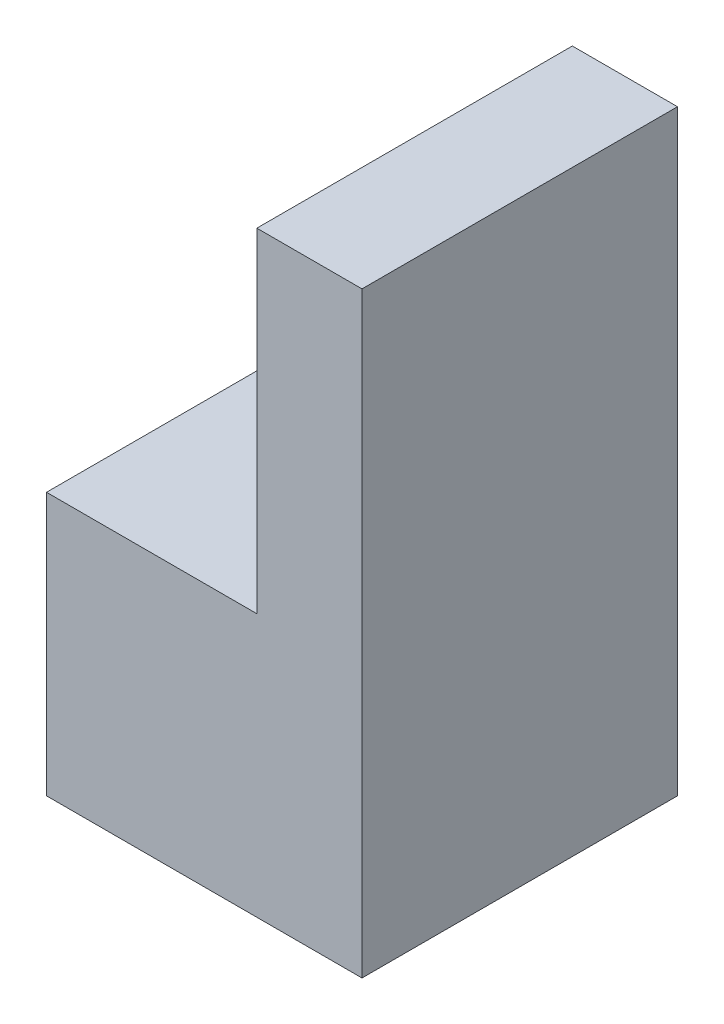
ISO-10303-21;
HEADER;
FILE_DESCRIPTION(('STEP AP214'),'2;1');
FILE_NAME('part.step','',(''),(''),'','','');
FILE_SCHEMA(('AUTOMOTIVE_DESIGN { 1 0 10303 214 1 1 1 1 }'));
ENDSEC;
DATA;
#1=APPLICATION_CONTEXT('core data for automotive mechanical design processes');
#2=APPLICATION_PROTOCOL_DEFINITION('international standard','automotive_design',2000,#1);
#3=PRODUCT_CONTEXT('',#1,'mechanical');
#4=PRODUCT('Part','Part','',(#3));
#5=PRODUCT_RELATED_PRODUCT_CATEGORY('part','',(#4));
#6=PRODUCT_DEFINITION_FORMATION('','',#4);
#7=PRODUCT_DEFINITION_CONTEXT('part definition',#1,'design');
#8=PRODUCT_DEFINITION('design','',#6,#7);
#9=PRODUCT_DEFINITION_SHAPE('','',#8);
#10=(LENGTH_UNIT() NAMED_UNIT(*) SI_UNIT(.MILLI.,.METRE.));
#11=(NAMED_UNIT(*) PLANE_ANGLE_UNIT() SI_UNIT($,.RADIAN.));
#12=(NAMED_UNIT(*) SI_UNIT($,.STERADIAN.) SOLID_ANGLE_UNIT());
#13=UNCERTAINTY_MEASURE_WITH_UNIT(LENGTH_MEASURE(1.E-05),#10,'distance_accuracy_value','');
#14=(GEOMETRIC_REPRESENTATION_CONTEXT(3) GLOBAL_UNCERTAINTY_ASSIGNED_CONTEXT((#13)) GLOBAL_UNIT_ASSIGNED_CONTEXT((#10,
#11,#12)) REPRESENTATION_CONTEXT('',''));
#15=CARTESIAN_POINT('',(0.,0.,0.));
#16=DIRECTION('',(0.,0.,1.));
#17=DIRECTION('',(1.,0.,0.));
#18=AXIS2_PLACEMENT_3D('',#15,#16,#17);
#19=CARTESIAN_POINT('',(0.,20.,0.));
#20=DIRECTION('',(0.,-1.,0.));
#21=DIRECTION('',(0.,0.,-1.));
#22=AXIS2_PLACEMENT_3D('',#19,#20,#21);
#23=PLANE('',#22);
#24=DIRECTION('',(0.,0.,1.));
#25=VECTOR('',#24,1.);
#26=CARTESIAN_POINT('',(16.,20.,-24.));
#27=LINE('',#26,#25);
#28=CARTESIAN_POINT('',(16.,20.,-24.));
#29=VERTEX_POINT('',#28);
#30=CARTESIAN_POINT('',(16.,20.,0.));
#31=VERTEX_POINT('',#30);
#32=EDGE_CURVE('E48',#29,#31,#27,.T.);
#33=ORIENTED_EDGE('',*,*,#32,.F.);
#34=DIRECTION('',(-1.,0.,0.));
#35=VECTOR('',#34,1.);
#36=CARTESIAN_POINT('',(0.,20.,-24.));
#37=LINE('',#36,#35);
#38=CARTESIAN_POINT('',(0.,20.,-24.));
#39=VERTEX_POINT('',#38);
#40=EDGE_CURVE('E53',#29,#39,#37,.T.);
#41=ORIENTED_EDGE('',*,*,#40,.T.);
#42=DIRECTION('',(0.,0.,1.));
#43=VECTOR('',#42,1.);
#44=CARTESIAN_POINT('',(0.,20.,0.));
#45=LINE('',#44,#43);
#46=CARTESIAN_POINT('',(0.,20.,0.));
#47=VERTEX_POINT('',#46);
#48=EDGE_CURVE('E84',#39,#47,#45,.T.);
#49=ORIENTED_EDGE('',*,*,#48,.T.);
#50=DIRECTION('',(1.,0.,0.));
#51=VECTOR('',#50,1.);
#52=CARTESIAN_POINT('',(0.,20.,0.));
#53=LINE('',#52,#51);
#54=EDGE_CURVE('E135',#47,#31,#53,.T.);
#55=ORIENTED_EDGE('',*,*,#54,.T.);
#56=EDGE_LOOP('',(#33,#41,#49,#55));
#57=FACE_BOUND('',#56,.T.);
#58=ADVANCED_FACE('F33',(#57),#23,.F.);
#59=CARTESIAN_POINT('',(0.,20.,0.));
#60=DIRECTION('',(1.,0.,0.));
#61=DIRECTION('',(0.,0.,-1.));
#62=AXIS2_PLACEMENT_3D('',#59,#60,#61);
#63=PLANE('',#62);
#64=DIRECTION('',(0.,0.,1.));
#65=VECTOR('',#64,1.);
#66=CARTESIAN_POINT('',(0.,0.,0.));
#67=LINE('',#66,#65);
#68=CARTESIAN_POINT('',(0.,0.,-24.));
#69=VERTEX_POINT('',#68);
#70=CARTESIAN_POINT('',(0.,0.,0.));
#71=VERTEX_POINT('',#70);
#72=EDGE_CURVE('E90',#69,#71,#67,.T.);
#73=ORIENTED_EDGE('',*,*,#72,.T.);
#74=DIRECTION('',(0.,-1.,0.));
#75=VECTOR('',#74,1.);
#76=CARTESIAN_POINT('',(0.,20.,0.));
#77=LINE('',#76,#75);
#78=EDGE_CURVE('E11',#47,#71,#77,.T.);
#79=ORIENTED_EDGE('',*,*,#78,.F.);
#80=ORIENTED_EDGE('',*,*,#48,.F.);
#81=DIRECTION('',(0.,-1.,0.));
#82=VECTOR('',#81,1.);
#83=CARTESIAN_POINT('',(0.,20.,-24.));
#84=LINE('',#83,#82);
#85=EDGE_CURVE('E76',#39,#69,#84,.T.);
#86=ORIENTED_EDGE('',*,*,#85,.T.);
#87=EDGE_LOOP('',(#73,#79,#80,#86));
#88=FACE_BOUND('',#87,.T.);
#89=ADVANCED_FACE('F35',(#88),#63,.F.);
#90=CARTESIAN_POINT('',(0.,20.,0.));
#91=DIRECTION('',(0.,0.,-1.));
#92=DIRECTION('',(-1.,0.,0.));
#93=AXIS2_PLACEMENT_3D('',#90,#91,#92);
#94=PLANE('',#93);
#95=DIRECTION('',(1.,0.,0.));
#96=VECTOR('',#95,1.);
#97=CARTESIAN_POINT('',(0.,0.,0.));
#98=LINE('',#97,#96);
#99=CARTESIAN_POINT('',(24.,0.,0.));
#100=VERTEX_POINT('',#99);
#101=EDGE_CURVE('E93',#71,#100,#98,.T.);
#102=ORIENTED_EDGE('',*,*,#101,.T.);
#103=DIRECTION('',(0.,-1.,0.));
#104=VECTOR('',#103,1.);
#105=CARTESIAN_POINT('',(24.,20.,0.));
#106=LINE('',#105,#104);
#107=CARTESIAN_POINT('',(24.,45.4,0.));
#108=VERTEX_POINT('',#107);
#109=EDGE_CURVE('E41',#108,#100,#106,.T.);
#110=ORIENTED_EDGE('',*,*,#109,.F.);
#111=DIRECTION('',(1.,0.,0.));
#112=VECTOR('',#111,1.);
#113=CARTESIAN_POINT('',(24.,45.4,0.));
#114=LINE('',#113,#112);
#115=CARTESIAN_POINT('',(16.,45.4,0.));
#116=VERTEX_POINT('',#115);
#117=EDGE_CURVE('E117',#116,#108,#114,.T.);
#118=ORIENTED_EDGE('',*,*,#117,.F.);
#119=DIRECTION('',(0.,-1.,0.));
#120=VECTOR('',#119,1.);
#121=CARTESIAN_POINT('',(16.,45.4,0.));
#122=LINE('',#121,#120);
#123=EDGE_CURVE('E98',#116,#31,#122,.T.);
#124=ORIENTED_EDGE('',*,*,#123,.T.);
#125=ORIENTED_EDGE('',*,*,#54,.F.);
#126=ORIENTED_EDGE('',*,*,#78,.T.);
#127=EDGE_LOOP('',(#102,#110,#118,#124,#125,#126));
#128=FACE_BOUND('',#127,.T.);
#129=ADVANCED_FACE('F114',(#128),#94,.F.);
#130=CARTESIAN_POINT('',(24.,20.,0.));
#131=DIRECTION('',(-1.,0.,0.));
#132=DIRECTION('',(0.,0.,1.));
#133=AXIS2_PLACEMENT_3D('',#130,#131,#132);
#134=PLANE('',#133);
#135=DIRECTION('',(0.,0.,-1.));
#136=VECTOR('',#135,1.);
#137=CARTESIAN_POINT('',(24.,0.,0.));
#138=LINE('',#137,#136);
#139=CARTESIAN_POINT('',(24.,0.,-24.));
#140=VERTEX_POINT('',#139);
#141=EDGE_CURVE('E85',#100,#140,#138,.T.);
#142=ORIENTED_EDGE('',*,*,#141,.T.);
#143=DIRECTION('',(0.,-1.,0.));
#144=VECTOR('',#143,1.);
#145=CARTESIAN_POINT('',(24.,20.,-24.));
#146=LINE('',#145,#144);
#147=CARTESIAN_POINT('',(24.,45.4,-24.));
#148=VERTEX_POINT('',#147);
#149=EDGE_CURVE('E80',#148,#140,#146,.T.);
#150=ORIENTED_EDGE('',*,*,#149,.F.);
#151=DIRECTION('',(0.,0.,-1.));
#152=VECTOR('',#151,1.);
#153=CARTESIAN_POINT('',(24.,45.4,-24.));
#154=LINE('',#153,#152);
#155=EDGE_CURVE('E110',#108,#148,#154,.T.);
#156=ORIENTED_EDGE('',*,*,#155,.F.);
#157=ORIENTED_EDGE('',*,*,#109,.T.);
#158=EDGE_LOOP('',(#142,#150,#156,#157));
#159=FACE_BOUND('',#158,.T.);
#160=ADVANCED_FACE('F108',(#159),#134,.F.);
#161=CARTESIAN_POINT('',(0.,20.,-24.));
#162=DIRECTION('',(0.,0.,1.));
#163=DIRECTION('',(1.,0.,0.));
#164=AXIS2_PLACEMENT_3D('',#161,#162,#163);
#165=PLANE('',#164);
#166=DIRECTION('',(-1.,0.,0.));
#167=VECTOR('',#166,1.);
#168=CARTESIAN_POINT('',(0.,0.,-24.));
#169=LINE('',#168,#167);
#170=EDGE_CURVE('E73',#140,#69,#169,.T.);
#171=ORIENTED_EDGE('',*,*,#170,.T.);
#172=ORIENTED_EDGE('',*,*,#85,.F.);
#173=ORIENTED_EDGE('',*,*,#40,.F.);
#174=DIRECTION('',(0.,-1.,0.));
#175=VECTOR('',#174,1.);
#176=CARTESIAN_POINT('',(16.,45.4,-24.));
#177=LINE('',#176,#175);
#178=CARTESIAN_POINT('',(16.,45.4,-24.));
#179=VERTEX_POINT('',#178);
#180=EDGE_CURVE('E94',#179,#29,#177,.T.);
#181=ORIENTED_EDGE('',*,*,#180,.F.);
#182=DIRECTION('',(-1.,0.,0.));
#183=VECTOR('',#182,1.);
#184=CARTESIAN_POINT('',(24.,45.4,-24.));
#185=LINE('',#184,#183);
#186=EDGE_CURVE('E129',#148,#179,#185,.T.);
#187=ORIENTED_EDGE('',*,*,#186,.F.);
#188=ORIENTED_EDGE('',*,*,#149,.T.);
#189=EDGE_LOOP('',(#171,#172,#173,#181,#187,#188));
#190=FACE_BOUND('',#189,.T.);
#191=ADVANCED_FACE('F75',(#190),#165,.F.);
#192=CARTESIAN_POINT('',(0.,0.,0.));
#193=DIRECTION('',(0.,-1.,0.));
#194=DIRECTION('',(0.,0.,-1.));
#195=AXIS2_PLACEMENT_3D('',#192,#193,#194);
#196=PLANE('',#195);
#197=CARTESIAN_POINT('',(20.,0.,-15.9999999999999));
#198=DIRECTION('',(0.,-1.,0.));
#199=DIRECTION('',(0.,0.,-1.));
#200=AXIS2_PLACEMENT_3D('',#197,#198,#199);
#201=CIRCLE('',#200,1.65);
#202=CARTESIAN_POINT('',(20.,0.,-17.6499999999999));
#203=VERTEX_POINT('',#202);
#204=EDGE_CURVE('E155',#203,#203,#201,.T.);
#205=ORIENTED_EDGE('',*,*,#204,.F.);
#206=EDGE_LOOP('',(#205));
#207=FACE_BOUND('',#206,.T.);
#208=CARTESIAN_POINT('',(4.,0.,-8.));
#209=DIRECTION('',(0.,-1.,0.));
#210=DIRECTION('',(0.,0.,-1.));
#211=AXIS2_PLACEMENT_3D('',#208,#209,#210);
#212=CIRCLE('',#211,1.65);
#213=CARTESIAN_POINT('',(4.,0.,-9.65));
#214=VERTEX_POINT('',#213);
#215=EDGE_CURVE('E161',#214,#214,#212,.T.);
#216=ORIENTED_EDGE('',*,*,#215,.F.);
#217=EDGE_LOOP('',(#216));
#218=FACE_BOUND('',#217,.T.);
#219=CARTESIAN_POINT('',(4.,0.,-16.));
#220=DIRECTION('',(0.,-1.,0.));
#221=DIRECTION('',(0.,0.,-1.));
#222=AXIS2_PLACEMENT_3D('',#219,#220,#221);
#223=CIRCLE('',#222,1.65);
#224=CARTESIAN_POINT('',(4.,0.,-17.65));
#225=VERTEX_POINT('',#224);
#226=EDGE_CURVE('E167',#225,#225,#223,.T.);
#227=ORIENTED_EDGE('',*,*,#226,.F.);
#228=EDGE_LOOP('',(#227));
#229=FACE_BOUND('',#228,.T.);
#230=CARTESIAN_POINT('',(12.,0.,-7.99999999999994));
#231=DIRECTION('',(0.,-1.,0.));
#232=DIRECTION('',(0.,0.,-1.));
#233=AXIS2_PLACEMENT_3D('',#230,#231,#232);
#234=CIRCLE('',#233,1.65);
#235=CARTESIAN_POINT('',(12.,0.,-9.64999999999995));
#236=VERTEX_POINT('',#235);
#237=EDGE_CURVE('E173',#236,#236,#234,.T.);
#238=ORIENTED_EDGE('',*,*,#237,.F.);
#239=EDGE_LOOP('',(#238));
#240=FACE_BOUND('',#239,.T.);
#241=CARTESIAN_POINT('',(12.,0.,-15.9999999999999));
#242=DIRECTION('',(0.,-1.,0.));
#243=DIRECTION('',(0.,0.,-1.));
#244=AXIS2_PLACEMENT_3D('',#241,#242,#243);
#245=CIRCLE('',#244,1.65);
#246=CARTESIAN_POINT('',(12.,0.,-17.6499999999999));
#247=VERTEX_POINT('',#246);
#248=EDGE_CURVE('E149',#247,#247,#245,.T.);
#249=ORIENTED_EDGE('',*,*,#248,.F.);
#250=EDGE_LOOP('',(#249));
#251=FACE_BOUND('',#250,.T.);
#252=CARTESIAN_POINT('',(20.,0.,-7.99999999999989));
#253=DIRECTION('',(0.,-1.,0.));
#254=DIRECTION('',(0.,0.,-1.));
#255=AXIS2_PLACEMENT_3D('',#252,#253,#254);
#256=CIRCLE('',#255,1.65);
#257=CARTESIAN_POINT('',(20.,0.,-9.64999999999989));
#258=VERTEX_POINT('',#257);
#259=EDGE_CURVE('E146',#258,#258,#256,.T.);
#260=ORIENTED_EDGE('',*,*,#259,.F.);
#261=EDGE_LOOP('',(#260));
#262=FACE_BOUND('',#261,.T.);
#263=ORIENTED_EDGE('',*,*,#72,.F.);
#264=ORIENTED_EDGE('',*,*,#170,.F.);
#265=ORIENTED_EDGE('',*,*,#141,.F.);
#266=ORIENTED_EDGE('',*,*,#101,.F.);
#267=EDGE_LOOP('',(#263,#264,#265,#266));
#268=FACE_BOUND('',#267,.T.);
#269=ADVANCED_FACE('F92',(#207,#218,#229,#240,#251,#262,#268),#196,.T.);
#270=CARTESIAN_POINT('',(16.,45.4,-24.));
#271=DIRECTION('',(1.,0.,0.));
#272=DIRECTION('',(0.,0.,-1.));
#273=AXIS2_PLACEMENT_3D('',#270,#271,#272);
#274=PLANE('',#273);
#275=ORIENTED_EDGE('',*,*,#32,.T.);
#276=ORIENTED_EDGE('',*,*,#123,.F.);
#277=DIRECTION('',(0.,0.,1.));
#278=VECTOR('',#277,1.);
#279=CARTESIAN_POINT('',(16.,45.4,-24.));
#280=LINE('',#279,#278);
#281=EDGE_CURVE('E125',#179,#116,#280,.T.);
#282=ORIENTED_EDGE('',*,*,#281,.F.);
#283=ORIENTED_EDGE('',*,*,#180,.T.);
#284=EDGE_LOOP('',(#275,#276,#282,#283));
#285=FACE_BOUND('',#284,.T.);
#286=ADVANCED_FACE('F138',(#285),#274,.F.);
#287=CARTESIAN_POINT('',(0.,45.4,0.));
#288=DIRECTION('',(0.,-1.,0.));
#289=DIRECTION('',(0.,0.,-1.));
#290=AXIS2_PLACEMENT_3D('',#287,#288,#289);
#291=PLANE('',#290);
#292=ORIENTED_EDGE('',*,*,#155,.T.);
#293=ORIENTED_EDGE('',*,*,#186,.T.);
#294=ORIENTED_EDGE('',*,*,#281,.T.);
#295=ORIENTED_EDGE('',*,*,#117,.T.);
#296=EDGE_LOOP('',(#292,#293,#294,#295));
#297=FACE_BOUND('',#296,.T.);
#298=ADVANCED_FACE('F121',(#297),#291,.F.);
#299=CARTESIAN_POINT('',(20.,15.,-7.99999999999989));
#300=DIRECTION('',(0.,-1.,0.));
#301=DIRECTION('',(0.,0.,-1.));
#302=AXIS2_PLACEMENT_3D('',#299,#300,#301);
#303=CYLINDRICAL_SURFACE('',#302,1.65);
#304=CARTESIAN_POINT('',(20.,15.,-7.99999999999989));
#305=DIRECTION('',(0.,-1.,0.));
#306=DIRECTION('',(0.,0.,-1.));
#307=AXIS2_PLACEMENT_3D('',#304,#305,#306);
#308=CIRCLE('',#307,1.65);
#309=CARTESIAN_POINT('',(20.,15.,-9.64999999999989));
#310=VERTEX_POINT('',#309);
#311=EDGE_CURVE('E133',#310,#310,#308,.T.);
#312=ORIENTED_EDGE('',*,*,#311,.F.);
#313=EDGE_LOOP('',(#312));
#314=FACE_BOUND('',#313,.T.);
#315=ORIENTED_EDGE('',*,*,#259,.T.);
#316=EDGE_LOOP('',(#315));
#317=FACE_BOUND('',#316,.T.);
#318=ADVANCED_FACE('F190',(#314,#317),#303,.F.);
#319=CARTESIAN_POINT('',(0.,15.,0.));
#320=DIRECTION('',(0.,-1.,0.));
#321=DIRECTION('',(0.,0.,-1.));
#322=AXIS2_PLACEMENT_3D('',#319,#320,#321);
#323=PLANE('',#322);
#324=ORIENTED_EDGE('',*,*,#311,.T.);
#325=EDGE_LOOP('',(#324));
#326=FACE_BOUND('',#325,.T.);
#327=ADVANCED_FACE('F192',(#326),#323,.T.);
#328=CARTESIAN_POINT('',(12.,15.,-15.9999999999999));
#329=DIRECTION('',(0.,-1.,0.));
#330=DIRECTION('',(0.,0.,-1.));
#331=AXIS2_PLACEMENT_3D('',#328,#329,#330);
#332=CYLINDRICAL_SURFACE('',#331,1.65);
#333=CARTESIAN_POINT('',(12.,15.,-15.9999999999999));
#334=DIRECTION('',(0.,-1.,0.));
#335=DIRECTION('',(0.,0.,-1.));
#336=AXIS2_PLACEMENT_3D('',#333,#334,#335);
#337=CIRCLE('',#336,1.65);
#338=CARTESIAN_POINT('',(12.,15.,-17.6499999999999));
#339=VERTEX_POINT('',#338);
#340=EDGE_CURVE('E176',#339,#339,#337,.T.);
#341=ORIENTED_EDGE('',*,*,#340,.F.);
#342=EDGE_LOOP('',(#341));
#343=FACE_BOUND('',#342,.T.);
#344=ORIENTED_EDGE('',*,*,#248,.T.);
#345=EDGE_LOOP('',(#344));
#346=FACE_BOUND('',#345,.T.);
#347=ADVANCED_FACE('F182',(#343,#346),#332,.F.);
#348=CARTESIAN_POINT('',(0.,15.,0.));
#349=DIRECTION('',(0.,-1.,0.));
#350=DIRECTION('',(0.,0.,-1.));
#351=AXIS2_PLACEMENT_3D('',#348,#349,#350);
#352=PLANE('',#351);
#353=ORIENTED_EDGE('',*,*,#340,.T.);
#354=EDGE_LOOP('',(#353));
#355=FACE_BOUND('',#354,.T.);
#356=ADVANCED_FACE('F260',(#355),#352,.T.);
#357=CARTESIAN_POINT('',(12.,15.,-7.99999999999994));
#358=DIRECTION('',(0.,-1.,0.));
#359=DIRECTION('',(0.,0.,-1.));
#360=AXIS2_PLACEMENT_3D('',#357,#358,#359);
#361=CYLINDRICAL_SURFACE('',#360,1.65);
#362=CARTESIAN_POINT('',(12.,15.,-7.99999999999994));
#363=DIRECTION('',(0.,-1.,0.));
#364=DIRECTION('',(0.,0.,-1.));
#365=AXIS2_PLACEMENT_3D('',#362,#363,#364);
#366=CIRCLE('',#365,1.65);
#367=CARTESIAN_POINT('',(12.,15.,-9.64999999999995));
#368=VERTEX_POINT('',#367);
#369=EDGE_CURVE('E170',#368,#368,#366,.T.);
#370=ORIENTED_EDGE('',*,*,#369,.F.);
#371=EDGE_LOOP('',(#370));
#372=FACE_BOUND('',#371,.T.);
#373=ORIENTED_EDGE('',*,*,#237,.T.);
#374=EDGE_LOOP('',(#373));
#375=FACE_BOUND('',#374,.T.);
#376=ADVANCED_FACE('F269',(#372,#375),#361,.F.);
#377=CARTESIAN_POINT('',(0.,15.,0.));
#378=DIRECTION('',(0.,-1.,0.));
#379=DIRECTION('',(0.,0.,-1.));
#380=AXIS2_PLACEMENT_3D('',#377,#378,#379);
#381=PLANE('',#380);
#382=ORIENTED_EDGE('',*,*,#369,.T.);
#383=EDGE_LOOP('',(#382));
#384=FACE_BOUND('',#383,.T.);
#385=ADVANCED_FACE('F278',(#384),#381,.T.);
#386=CARTESIAN_POINT('',(4.,15.,-16.));
#387=DIRECTION('',(0.,-1.,0.));
#388=DIRECTION('',(0.,0.,-1.));
#389=AXIS2_PLACEMENT_3D('',#386,#387,#388);
#390=CYLINDRICAL_SURFACE('',#389,1.65);
#391=CARTESIAN_POINT('',(4.,15.,-16.));
#392=DIRECTION('',(0.,-1.,0.));
#393=DIRECTION('',(0.,0.,-1.));
#394=AXIS2_PLACEMENT_3D('',#391,#392,#393);
#395=CIRCLE('',#394,1.65);
#396=CARTESIAN_POINT('',(4.,15.,-17.65));
#397=VERTEX_POINT('',#396);
#398=EDGE_CURVE('E164',#397,#397,#395,.T.);
#399=ORIENTED_EDGE('',*,*,#398,.F.);
#400=EDGE_LOOP('',(#399));
#401=FACE_BOUND('',#400,.T.);
#402=ORIENTED_EDGE('',*,*,#226,.T.);
#403=EDGE_LOOP('',(#402));
#404=FACE_BOUND('',#403,.T.);
#405=ADVANCED_FACE('F287',(#401,#404),#390,.F.);
#406=CARTESIAN_POINT('',(0.,15.,0.));
#407=DIRECTION('',(0.,-1.,0.));
#408=DIRECTION('',(0.,0.,-1.));
#409=AXIS2_PLACEMENT_3D('',#406,#407,#408);
#410=PLANE('',#409);
#411=ORIENTED_EDGE('',*,*,#398,.T.);
#412=EDGE_LOOP('',(#411));
#413=FACE_BOUND('',#412,.T.);
#414=ADVANCED_FACE('F296',(#413),#410,.T.);
#415=CARTESIAN_POINT('',(4.,15.,-8.));
#416=DIRECTION('',(0.,-1.,0.));
#417=DIRECTION('',(0.,0.,-1.));
#418=AXIS2_PLACEMENT_3D('',#415,#416,#417);
#419=CYLINDRICAL_SURFACE('',#418,1.65);
#420=CARTESIAN_POINT('',(4.,15.,-8.));
#421=DIRECTION('',(0.,-1.,0.));
#422=DIRECTION('',(0.,0.,-1.));
#423=AXIS2_PLACEMENT_3D('',#420,#421,#422);
#424=CIRCLE('',#423,1.65);
#425=CARTESIAN_POINT('',(4.,15.,-9.65));
#426=VERTEX_POINT('',#425);
#427=EDGE_CURVE('E158',#426,#426,#424,.T.);
#428=ORIENTED_EDGE('',*,*,#427,.F.);
#429=EDGE_LOOP('',(#428));
#430=FACE_BOUND('',#429,.T.);
#431=ORIENTED_EDGE('',*,*,#215,.T.);
#432=EDGE_LOOP('',(#431));
#433=FACE_BOUND('',#432,.T.);
#434=ADVANCED_FACE('F305',(#430,#433),#419,.F.);
#435=CARTESIAN_POINT('',(0.,15.,0.));
#436=DIRECTION('',(0.,-1.,0.));
#437=DIRECTION('',(0.,0.,-1.));
#438=AXIS2_PLACEMENT_3D('',#435,#436,#437);
#439=PLANE('',#438);
#440=ORIENTED_EDGE('',*,*,#427,.T.);
#441=EDGE_LOOP('',(#440));
#442=FACE_BOUND('',#441,.T.);
#443=ADVANCED_FACE('F317',(#442),#439,.T.);
#444=CARTESIAN_POINT('',(20.,15.,-15.9999999999999));
#445=DIRECTION('',(0.,-1.,0.));
#446=DIRECTION('',(0.,0.,-1.));
#447=AXIS2_PLACEMENT_3D('',#444,#445,#446);
#448=CYLINDRICAL_SURFACE('',#447,1.65);
#449=CARTESIAN_POINT('',(20.,15.,-15.9999999999999));
#450=DIRECTION('',(0.,-1.,0.));
#451=DIRECTION('',(0.,0.,-1.));
#452=AXIS2_PLACEMENT_3D('',#449,#450,#451);
#453=CIRCLE('',#452,1.65);
#454=CARTESIAN_POINT('',(20.,15.,-17.6499999999999));
#455=VERTEX_POINT('',#454);
#456=EDGE_CURVE('E152',#455,#455,#453,.T.);
#457=ORIENTED_EDGE('',*,*,#456,.F.);
#458=EDGE_LOOP('',(#457));
#459=FACE_BOUND('',#458,.T.);
#460=ORIENTED_EDGE('',*,*,#204,.T.);
#461=EDGE_LOOP('',(#460));
#462=FACE_BOUND('',#461,.T.);
#463=ADVANCED_FACE('F326',(#459,#462),#448,.F.);
#464=CARTESIAN_POINT('',(20.,15.,-15.9999999999999));
#465=DIRECTION('',(0.,-1.,0.));
#466=DIRECTION('',(0.,0.,-1.));
#467=AXIS2_PLACEMENT_3D('',#464,#465,#466);
#468=PLANE('',#467);
#469=ORIENTED_EDGE('',*,*,#456,.T.);
#470=EDGE_LOOP('',(#469));
#471=FACE_BOUND('',#470,.T.);
#472=ADVANCED_FACE('F335',(#471),#468,.T.);
#473=CLOSED_SHELL('',(#58,#89,#129,#160,#191,#269,#286,#298,#318,#327,#347,#356,#376,#385,#405,
#414,#434,#443,#463,#472));
#474=MANIFOLD_SOLID_BREP('B2',#473);
#475=ADVANCED_BREP_SHAPE_REPRESENTATION('',(#18,#474),#14);
#476=SHAPE_DEFINITION_REPRESENTATION(#9,#475);
ENDSEC;
END-ISO-10303-21;
